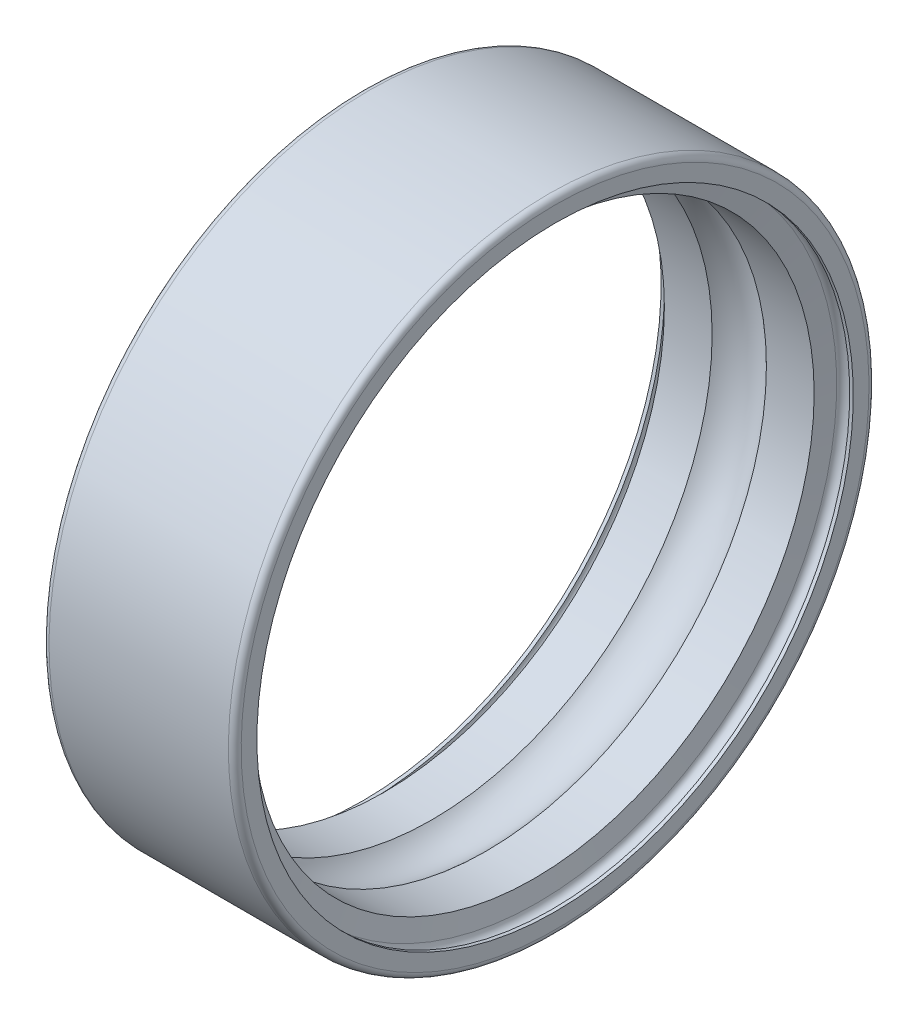
ISO-10303-21;
HEADER;
FILE_DESCRIPTION(('STEP AP214'),'2;1');
FILE_NAME('part.step','',(''),(''),'','','');
FILE_SCHEMA(('AUTOMOTIVE_DESIGN { 1 0 10303 214 1 1 1 1 }'));
ENDSEC;
DATA;
#1=APPLICATION_CONTEXT('core data for automotive mechanical design processes');
#2=APPLICATION_PROTOCOL_DEFINITION('international standard','automotive_design',2000,#1);
#3=PRODUCT_CONTEXT('',#1,'mechanical');
#4=PRODUCT('Part','Part','',(#3));
#5=PRODUCT_RELATED_PRODUCT_CATEGORY('part','',(#4));
#6=PRODUCT_DEFINITION_FORMATION('','',#4);
#7=PRODUCT_DEFINITION_CONTEXT('part definition',#1,'design');
#8=PRODUCT_DEFINITION('design','',#6,#7);
#9=PRODUCT_DEFINITION_SHAPE('','',#8);
#10=(LENGTH_UNIT() NAMED_UNIT(*) SI_UNIT(.MILLI.,.METRE.));
#11=(NAMED_UNIT(*) PLANE_ANGLE_UNIT() SI_UNIT($,.RADIAN.));
#12=(NAMED_UNIT(*) SI_UNIT($,.STERADIAN.) SOLID_ANGLE_UNIT());
#13=UNCERTAINTY_MEASURE_WITH_UNIT(LENGTH_MEASURE(1.E-05),#10,'distance_accuracy_value','');
#14=(GEOMETRIC_REPRESENTATION_CONTEXT(3) GLOBAL_UNCERTAINTY_ASSIGNED_CONTEXT((#13)) GLOBAL_UNIT_ASSIGNED_CONTEXT((#10,
#11,#12)) REPRESENTATION_CONTEXT('',''));
#15=CARTESIAN_POINT('',(0.,0.,0.));
#16=DIRECTION('',(0.,0.,1.));
#17=DIRECTION('',(1.,0.,0.));
#18=AXIS2_PLACEMENT_3D('',#15,#16,#17);
#19=CARTESIAN_POINT('',(2.832,0.,0.));
#20=DIRECTION('',(1.,0.,0.));
#21=DIRECTION('',(0.,0.,1.));
#22=AXIS2_PLACEMENT_3D('',#19,#20,#21);
#23=TOROIDAL_SURFACE('',#22,4.655,0.112);
#24=CARTESIAN_POINT('',(2.944,0.,0.));
#25=DIRECTION('',(-1.,0.,0.));
#26=DIRECTION('',(0.,1.,0.));
#27=AXIS2_PLACEMENT_3D('',#24,#25,#26);
#28=CIRCLE('',#27,4.655);
#29=CARTESIAN_POINT('',(2.944,4.655,0.));
#30=VERTEX_POINT('',#29);
#31=EDGE_CURVE('E11',#30,#30,#28,.T.);
#32=ORIENTED_EDGE('',*,*,#31,.F.);
#33=EDGE_LOOP('',(#32));
#34=FACE_BOUND('',#33,.T.);
#35=CARTESIAN_POINT('',(2.72170153166263,0.,0.));
#36=DIRECTION('',(-1.,0.,0.));
#37=DIRECTION('',(0.,1.,0.));
#38=AXIS2_PLACEMENT_3D('',#35,#36,#37);
#39=CIRCLE('',#38,4.6744485958987);
#40=CARTESIAN_POINT('',(2.72170153166263,4.6744485958987,0.));
#41=VERTEX_POINT('',#40);
#42=EDGE_CURVE('E92',#41,#41,#39,.T.);
#43=ORIENTED_EDGE('',*,*,#42,.T.);
#44=EDGE_LOOP('',(#43));
#45=FACE_BOUND('',#44,.T.);
#46=ADVANCED_FACE('F37',(#34,#45),#23,.F.);
#47=CARTESIAN_POINT('',(2.972,0.,0.));
#48=DIRECTION('',(-1.,0.,0.));
#49=DIRECTION('',(0.,1.,0.));
#50=AXIS2_PLACEMENT_3D('',#47,#48,#49);
#51=CYLINDRICAL_SURFACE('',#50,4.655);
#52=CARTESIAN_POINT('',(3.,0.,0.));
#53=DIRECTION('',(-1.,0.,0.));
#54=DIRECTION('',(0.,1.,0.));
#55=AXIS2_PLACEMENT_3D('',#52,#53,#54);
#56=CIRCLE('',#55,4.655);
#57=CARTESIAN_POINT('',(3.,4.655,0.));
#58=VERTEX_POINT('',#57);
#59=EDGE_CURVE('E47',#58,#58,#56,.T.);
#60=ORIENTED_EDGE('',*,*,#59,.F.);
#61=EDGE_LOOP('',(#60));
#62=FACE_BOUND('',#61,.T.);
#63=ORIENTED_EDGE('',*,*,#31,.T.);
#64=EDGE_LOOP('',(#63));
#65=FACE_BOUND('',#64,.T.);
#66=ADVANCED_FACE('F142',(#62,#65),#51,.F.);
#67=CARTESIAN_POINT('',(3.,4.7775,0.));
#68=DIRECTION('',(1.,0.,0.));
#69=DIRECTION('',(0.,1.,0.));
#70=AXIS2_PLACEMENT_3D('',#67,#68,#69);
#71=PLANE('',#70);
#72=CARTESIAN_POINT('',(3.,0.,0.));
#73=DIRECTION('',(-1.,0.,0.));
#74=DIRECTION('',(0.,1.,0.));
#75=AXIS2_PLACEMENT_3D('',#72,#73,#74);
#76=CIRCLE('',#75,4.9);
#77=CARTESIAN_POINT('',(3.,4.9,0.));
#78=VERTEX_POINT('',#77);
#79=EDGE_CURVE('E83',#78,#78,#76,.T.);
#80=ORIENTED_EDGE('',*,*,#79,.F.);
#81=EDGE_LOOP('',(#80));
#82=FACE_BOUND('',#81,.T.);
#83=ORIENTED_EDGE('',*,*,#59,.T.);
#84=EDGE_LOOP('',(#83));
#85=FACE_BOUND('',#84,.T.);
#86=ADVANCED_FACE('F148',(#82,#85),#71,.T.);
#87=CARTESIAN_POINT('',(2.9,0.,0.));
#88=DIRECTION('',(1.,0.,0.));
#89=DIRECTION('',(0.,0.,1.));
#90=AXIS2_PLACEMENT_3D('',#87,#88,#89);
#91=TOROIDAL_SURFACE('',#90,4.9,0.1);
#92=CARTESIAN_POINT('',(2.9,0.,0.));
#93=DIRECTION('',(-1.,0.,0.));
#94=DIRECTION('',(0.,1.,0.));
#95=AXIS2_PLACEMENT_3D('',#92,#93,#94);
#96=CIRCLE('',#95,5.);
#97=CARTESIAN_POINT('',(2.9,5.,0.));
#98=VERTEX_POINT('',#97);
#99=EDGE_CURVE('E78',#98,#98,#96,.T.);
#100=ORIENTED_EDGE('',*,*,#99,.F.);
#101=EDGE_LOOP('',(#100));
#102=FACE_BOUND('',#101,.T.);
#103=ORIENTED_EDGE('',*,*,#79,.T.);
#104=EDGE_LOOP('',(#103));
#105=FACE_BOUND('',#104,.T.);
#106=ADVANCED_FACE('F171',(#102,#105),#91,.T.);
#107=CARTESIAN_POINT('',(1.5,0.,0.));
#108=DIRECTION('',(-1.,0.,0.));
#109=DIRECTION('',(0.,1.,0.));
#110=AXIS2_PLACEMENT_3D('',#107,#108,#109);
#111=CYLINDRICAL_SURFACE('',#110,5.);
#112=CARTESIAN_POINT('',(0.1,0.,0.));
#113=DIRECTION('',(-1.,0.,0.));
#114=DIRECTION('',(0.,1.,0.));
#115=AXIS2_PLACEMENT_3D('',#112,#113,#114);
#116=CIRCLE('',#115,5.);
#117=CARTESIAN_POINT('',(0.1,5.,0.));
#118=VERTEX_POINT('',#117);
#119=EDGE_CURVE('E102',#118,#118,#116,.T.);
#120=ORIENTED_EDGE('',*,*,#119,.F.);
#121=EDGE_LOOP('',(#120));
#122=FACE_BOUND('',#121,.T.);
#123=ORIENTED_EDGE('',*,*,#99,.T.);
#124=EDGE_LOOP('',(#123));
#125=FACE_BOUND('',#124,.T.);
#126=ADVANCED_FACE('F169',(#122,#125),#111,.T.);
#127=CARTESIAN_POINT('',(0.1,0.,0.));
#128=DIRECTION('',(1.,0.,0.));
#129=DIRECTION('',(0.,0.,1.));
#130=AXIS2_PLACEMENT_3D('',#127,#128,#129);
#131=TOROIDAL_SURFACE('',#130,4.9,0.1);
#132=CARTESIAN_POINT('',(0.,0.,0.));
#133=DIRECTION('',(-1.,0.,0.));
#134=DIRECTION('',(0.,1.,0.));
#135=AXIS2_PLACEMENT_3D('',#132,#133,#134);
#136=CIRCLE('',#135,4.9);
#137=CARTESIAN_POINT('',(0.,4.9,0.));
#138=VERTEX_POINT('',#137);
#139=EDGE_CURVE('E107',#138,#138,#136,.T.);
#140=ORIENTED_EDGE('',*,*,#139,.F.);
#141=EDGE_LOOP('',(#140));
#142=FACE_BOUND('',#141,.T.);
#143=ORIENTED_EDGE('',*,*,#119,.T.);
#144=EDGE_LOOP('',(#143));
#145=FACE_BOUND('',#144,.T.);
#146=ADVANCED_FACE('F39',(#142,#145),#131,.T.);
#147=CARTESIAN_POINT('',(0.,4.7775,0.));
#148=DIRECTION('',(-1.,0.,0.));
#149=DIRECTION('',(0.,-1.,0.));
#150=AXIS2_PLACEMENT_3D('',#147,#148,#149);
#151=PLANE('',#150);
#152=CARTESIAN_POINT('',(0.,0.,0.));
#153=DIRECTION('',(-1.,0.,0.));
#154=DIRECTION('',(0.,1.,0.));
#155=AXIS2_PLACEMENT_3D('',#152,#153,#154);
#156=CIRCLE('',#155,4.655);
#157=CARTESIAN_POINT('',(0.,4.655,0.));
#158=VERTEX_POINT('',#157);
#159=EDGE_CURVE('E41',#158,#158,#156,.T.);
#160=ORIENTED_EDGE('',*,*,#159,.F.);
#161=EDGE_LOOP('',(#160));
#162=FACE_BOUND('',#161,.T.);
#163=ORIENTED_EDGE('',*,*,#139,.T.);
#164=EDGE_LOOP('',(#163));
#165=FACE_BOUND('',#164,.T.);
#166=ADVANCED_FACE('F136',(#162,#165),#151,.T.);
#167=CARTESIAN_POINT('',(0.028,0.,0.));
#168=DIRECTION('',(-1.,0.,0.));
#169=DIRECTION('',(0.,1.,0.));
#170=AXIS2_PLACEMENT_3D('',#167,#168,#169);
#171=CYLINDRICAL_SURFACE('',#170,4.655);
#172=CARTESIAN_POINT('',(0.056,0.,0.));
#173=DIRECTION('',(-1.,0.,0.));
#174=DIRECTION('',(0.,1.,0.));
#175=AXIS2_PLACEMENT_3D('',#172,#173,#174);
#176=CIRCLE('',#175,4.655);
#177=CARTESIAN_POINT('',(0.056,4.655,0.));
#178=VERTEX_POINT('',#177);
#179=EDGE_CURVE('E114',#178,#178,#176,.T.);
#180=ORIENTED_EDGE('',*,*,#179,.F.);
#181=EDGE_LOOP('',(#180));
#182=FACE_BOUND('',#181,.T.);
#183=ORIENTED_EDGE('',*,*,#159,.T.);
#184=EDGE_LOOP('',(#183));
#185=FACE_BOUND('',#184,.T.);
#186=ADVANCED_FACE('F127',(#182,#185),#171,.F.);
#187=CARTESIAN_POINT('',(0.168,0.,0.));
#188=DIRECTION('',(1.,0.,0.));
#189=DIRECTION('',(0.,0.,1.));
#190=AXIS2_PLACEMENT_3D('',#187,#188,#189);
#191=TOROIDAL_SURFACE('',#190,4.655,0.112);
#192=CARTESIAN_POINT('',(0.278298468337367,0.,0.));
#193=DIRECTION('',(-1.,0.,0.));
#194=DIRECTION('',(0.,1.,0.));
#195=AXIS2_PLACEMENT_3D('',#192,#193,#194);
#196=CIRCLE('',#195,4.6744485958987);
#197=CARTESIAN_POINT('',(0.278298468337367,4.6744485958987,0.));
#198=VERTEX_POINT('',#197);
#199=EDGE_CURVE('E106',#198,#198,#196,.T.);
#200=ORIENTED_EDGE('',*,*,#199,.F.);
#201=EDGE_LOOP('',(#200));
#202=FACE_BOUND('',#201,.T.);
#203=ORIENTED_EDGE('',*,*,#179,.T.);
#204=EDGE_LOOP('',(#203));
#205=FACE_BOUND('',#204,.T.);
#206=ADVANCED_FACE('F125',(#202,#205),#191,.F.);
#207=CARTESIAN_POINT('',(0.304698901733471,0.,0.));
#208=DIRECTION('',(-1.,0.,0.));
#209=DIRECTION('',(0.,1.,0.));
#210=AXIS2_PLACEMENT_3D('',#207,#208,#209);
#211=CONICAL_SURFACE('',#210,4.52472429794935,1.39626340159546);
#212=CARTESIAN_POINT('',(0.331099335129574,0.,0.));
#213=DIRECTION('',(-1.,0.,0.));
#214=DIRECTION('',(0.,1.,0.));
#215=AXIS2_PLACEMENT_3D('',#212,#213,#214);
#216=CIRCLE('',#215,4.375);
#217=CARTESIAN_POINT('',(0.331099335129574,4.375,0.));
#218=VERTEX_POINT('',#217);
#219=EDGE_CURVE('E103',#218,#218,#216,.T.);
#220=ORIENTED_EDGE('',*,*,#219,.F.);
#221=EDGE_LOOP('',(#220));
#222=FACE_BOUND('',#221,.T.);
#223=ORIENTED_EDGE('',*,*,#199,.T.);
#224=EDGE_LOOP('',(#223));
#225=FACE_BOUND('',#224,.T.);
#226=ADVANCED_FACE('F123',(#222,#225),#211,.F.);
#227=CARTESIAN_POINT('',(0.70378623823857,0.,0.));
#228=DIRECTION('',(-1.,0.,0.));
#229=DIRECTION('',(0.,1.,0.));
#230=AXIS2_PLACEMENT_3D('',#227,#228,#229);
#231=CYLINDRICAL_SURFACE('',#230,4.375);
#232=CARTESIAN_POINT('',(1.07647314134756,0.,0.));
#233=DIRECTION('',(-1.,0.,0.));
#234=DIRECTION('',(0.,1.,0.));
#235=AXIS2_PLACEMENT_3D('',#232,#233,#234);
#236=CIRCLE('',#235,4.375);
#237=CARTESIAN_POINT('',(1.07647314134756,4.375,0.));
#238=VERTEX_POINT('',#237);
#239=EDGE_CURVE('E100',#238,#238,#236,.T.);
#240=ORIENTED_EDGE('',*,*,#239,.F.);
#241=EDGE_LOOP('',(#240));
#242=FACE_BOUND('',#241,.T.);
#243=ORIENTED_EDGE('',*,*,#219,.T.);
#244=EDGE_LOOP('',(#243));
#245=FACE_BOUND('',#244,.T.);
#246=ADVANCED_FACE('F133',(#242,#245),#231,.F.);
#247=CARTESIAN_POINT('',(1.5,0.,0.));
#248=DIRECTION('',(1.,0.,0.));
#249=DIRECTION('',(0.,0.,1.));
#250=AXIS2_PLACEMENT_3D('',#247,#248,#249);
#251=TOROIDAL_SURFACE('',#250,3.95,0.6);
#252=CARTESIAN_POINT('',(1.92352685865244,0.,0.));
#253=DIRECTION('',(-1.,0.,0.));
#254=DIRECTION('',(0.,1.,0.));
#255=AXIS2_PLACEMENT_3D('',#252,#253,#254);
#256=CIRCLE('',#255,4.375);
#257=CARTESIAN_POINT('',(1.92352685865244,4.375,0.));
#258=VERTEX_POINT('',#257);
#259=EDGE_CURVE('E94',#258,#258,#256,.T.);
#260=ORIENTED_EDGE('',*,*,#259,.F.);
#261=EDGE_LOOP('',(#260));
#262=FACE_BOUND('',#261,.T.);
#263=ORIENTED_EDGE('',*,*,#239,.T.);
#264=EDGE_LOOP('',(#263));
#265=FACE_BOUND('',#264,.T.);
#266=ADVANCED_FACE('F159',(#262,#265),#251,.F.);
#267=CARTESIAN_POINT('',(2.29621376176143,0.,0.));
#268=DIRECTION('',(-1.,0.,0.));
#269=DIRECTION('',(0.,1.,0.));
#270=AXIS2_PLACEMENT_3D('',#267,#268,#269);
#271=CYLINDRICAL_SURFACE('',#270,4.375);
#272=CARTESIAN_POINT('',(2.66890066487042,0.,0.));
#273=DIRECTION('',(-1.,0.,0.));
#274=DIRECTION('',(0.,1.,0.));
#275=AXIS2_PLACEMENT_3D('',#272,#273,#274);
#276=CIRCLE('',#275,4.375);
#277=CARTESIAN_POINT('',(2.66890066487042,4.375,0.));
#278=VERTEX_POINT('',#277);
#279=EDGE_CURVE('E89',#278,#278,#276,.T.);
#280=ORIENTED_EDGE('',*,*,#279,.F.);
#281=EDGE_LOOP('',(#280));
#282=FACE_BOUND('',#281,.T.);
#283=ORIENTED_EDGE('',*,*,#259,.T.);
#284=EDGE_LOOP('',(#283));
#285=FACE_BOUND('',#284,.T.);
#286=ADVANCED_FACE('F154',(#282,#285),#271,.F.);
#287=CARTESIAN_POINT('',(2.69530109826653,0.,0.));
#288=DIRECTION('',(1.,0.,0.));
#289=DIRECTION('',(0.,1.,0.));
#290=AXIS2_PLACEMENT_3D('',#287,#288,#289);
#291=CONICAL_SURFACE('',#290,4.52472429794935,1.39626340159546);
#292=ORIENTED_EDGE('',*,*,#42,.F.);
#293=EDGE_LOOP('',(#292));
#294=FACE_BOUND('',#293,.T.);
#295=ORIENTED_EDGE('',*,*,#279,.T.);
#296=EDGE_LOOP('',(#295));
#297=FACE_BOUND('',#296,.T.);
#298=ADVANCED_FACE('F90',(#294,#297),#291,.F.);
#299=CLOSED_SHELL('',(#46,#66,#86,#106,#126,#146,#166,#186,#206,#226,#246,#266,#286,#298));
#300=MANIFOLD_SOLID_BREP('B2',#299);
#301=ADVANCED_BREP_SHAPE_REPRESENTATION('',(#18,#300),#14);
#302=SHAPE_DEFINITION_REPRESENTATION(#9,#301);
ENDSEC;
END-ISO-10303-21;
